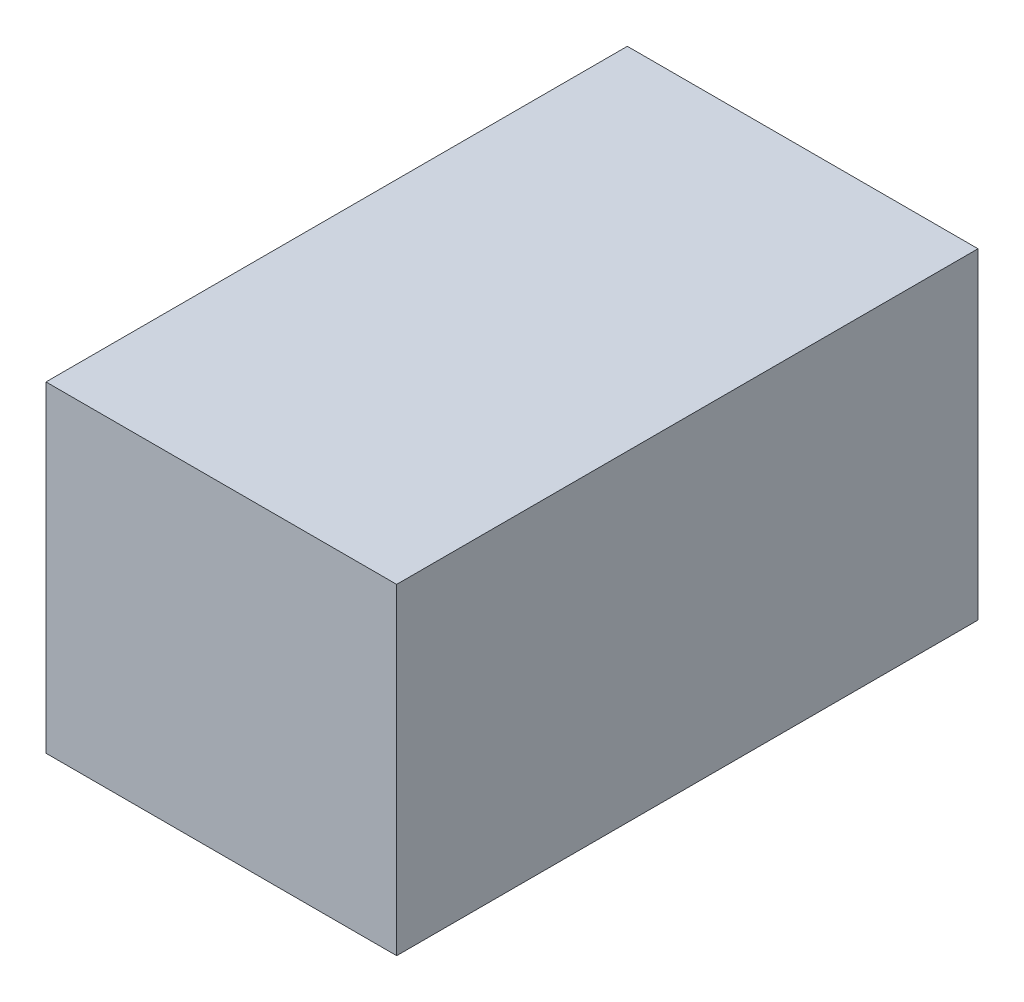
ISO-10303-21;
HEADER;
FILE_DESCRIPTION(('STEP AP214'),'2;1');
FILE_NAME('part.step','',(''),(''),'','','');
FILE_SCHEMA(('AUTOMOTIVE_DESIGN { 1 0 10303 214 1 1 1 1 }'));
ENDSEC;
DATA;
#1=APPLICATION_CONTEXT('core data for automotive mechanical design processes');
#2=APPLICATION_PROTOCOL_DEFINITION('international standard','automotive_design',2000,#1);
#3=PRODUCT_CONTEXT('',#1,'mechanical');
#4=PRODUCT('Part','Part','',(#3));
#5=PRODUCT_RELATED_PRODUCT_CATEGORY('part','',(#4));
#6=PRODUCT_DEFINITION_FORMATION('','',#4);
#7=PRODUCT_DEFINITION_CONTEXT('part definition',#1,'design');
#8=PRODUCT_DEFINITION('design','',#6,#7);
#9=PRODUCT_DEFINITION_SHAPE('','',#8);
#10=(LENGTH_UNIT() NAMED_UNIT(*) SI_UNIT(.MILLI.,.METRE.));
#11=(NAMED_UNIT(*) PLANE_ANGLE_UNIT() SI_UNIT($,.RADIAN.));
#12=(NAMED_UNIT(*) SI_UNIT($,.STERADIAN.) SOLID_ANGLE_UNIT());
#13=UNCERTAINTY_MEASURE_WITH_UNIT(LENGTH_MEASURE(1.E-05),#10,'distance_accuracy_value','');
#14=(GEOMETRIC_REPRESENTATION_CONTEXT(3) GLOBAL_UNCERTAINTY_ASSIGNED_CONTEXT((#13)) GLOBAL_UNIT_ASSIGNED_CONTEXT((#10,
#11,#12)) REPRESENTATION_CONTEXT('',''));
#15=CARTESIAN_POINT('',(0.,0.,0.));
#16=DIRECTION('',(0.,0.,1.));
#17=DIRECTION('',(1.,0.,0.));
#18=AXIS2_PLACEMENT_3D('',#15,#16,#17);
#19=CARTESIAN_POINT('',(-1086.5,576.,625.));
#20=DIRECTION('',(0.,1.,0.));
#21=DIRECTION('',(-1.,0.,0.));
#22=AXIS2_PLACEMENT_3D('',#19,#20,#21);
#23=PLANE('',#22);
#24=DIRECTION('',(1.,0.,0.));
#25=VECTOR('',#24,1.);
#26=CARTESIAN_POINT('',(-1370.,576.,1095.));
#27=LINE('',#26,#25);
#28=CARTESIAN_POINT('',(-1370.,576.,1095.));
#29=VERTEX_POINT('',#28);
#30=CARTESIAN_POINT('',(-803.,576.,1095.));
#31=VERTEX_POINT('',#30);
#32=EDGE_CURVE('E56',#29,#31,#27,.T.);
#33=ORIENTED_EDGE('',*,*,#32,.F.);
#34=DIRECTION('',(0.,0.,1.));
#35=VECTOR('',#34,1.);
#36=CARTESIAN_POINT('',(-1370.,576.,155.));
#37=LINE('',#36,#35);
#38=CARTESIAN_POINT('',(-1370.,576.,155.));
#39=VERTEX_POINT('',#38);
#40=EDGE_CURVE('E36',#39,#29,#37,.T.);
#41=ORIENTED_EDGE('',*,*,#40,.F.);
#42=DIRECTION('',(-1.,0.,0.));
#43=VECTOR('',#42,1.);
#44=CARTESIAN_POINT('',(-803.,576.,155.));
#45=LINE('',#44,#43);
#46=CARTESIAN_POINT('',(-803.,576.,155.));
#47=VERTEX_POINT('',#46);
#48=EDGE_CURVE('E65',#47,#39,#45,.T.);
#49=ORIENTED_EDGE('',*,*,#48,.F.);
#50=DIRECTION('',(0.,0.,-1.));
#51=VECTOR('',#50,1.);
#52=CARTESIAN_POINT('',(-803.,576.,1095.));
#53=LINE('',#52,#51);
#54=EDGE_CURVE('E27',#31,#47,#53,.T.);
#55=ORIENTED_EDGE('',*,*,#54,.F.);
#56=EDGE_LOOP('',(#33,#41,#49,#55));
#57=FACE_BOUND('',#56,.T.);
#58=ADVANCED_FACE('F17',(#57),#23,.F.);
#59=CARTESIAN_POINT('',(-803.,576.,1095.));
#60=DIRECTION('',(1.,0.,0.));
#61=DIRECTION('',(0.,1.,0.));
#62=AXIS2_PLACEMENT_3D('',#59,#60,#61);
#63=PLANE('',#62);
#64=DIRECTION('',(0.,1.,0.));
#65=VECTOR('',#64,1.);
#66=CARTESIAN_POINT('',(-803.,576.,155.));
#67=LINE('',#66,#65);
#68=CARTESIAN_POINT('',(-803.,1096.,155.));
#69=VERTEX_POINT('',#68);
#70=EDGE_CURVE('E11',#47,#69,#67,.T.);
#71=ORIENTED_EDGE('',*,*,#70,.T.);
#72=DIRECTION('',(0.,0.,-1.));
#73=VECTOR('',#72,1.);
#74=CARTESIAN_POINT('',(-803.,1096.,1095.));
#75=LINE('',#74,#73);
#76=CARTESIAN_POINT('',(-803.,1096.,1095.));
#77=VERTEX_POINT('',#76);
#78=EDGE_CURVE('E71',#77,#69,#75,.T.);
#79=ORIENTED_EDGE('',*,*,#78,.F.);
#80=DIRECTION('',(0.,1.,0.));
#81=VECTOR('',#80,1.);
#82=CARTESIAN_POINT('',(-803.,576.,1095.));
#83=LINE('',#82,#81);
#84=EDGE_CURVE('E60',#31,#77,#83,.T.);
#85=ORIENTED_EDGE('',*,*,#84,.F.);
#86=ORIENTED_EDGE('',*,*,#54,.T.);
#87=EDGE_LOOP('',(#71,#79,#85,#86));
#88=FACE_BOUND('',#87,.T.);
#89=ADVANCED_FACE('F70',(#88),#63,.T.);
#90=CARTESIAN_POINT('',(-1370.,576.,1095.));
#91=DIRECTION('',(0.,0.,1.));
#92=DIRECTION('',(-1.,0.,0.));
#93=AXIS2_PLACEMENT_3D('',#90,#91,#92);
#94=PLANE('',#93);
#95=ORIENTED_EDGE('',*,*,#84,.T.);
#96=DIRECTION('',(1.,0.,0.));
#97=VECTOR('',#96,1.);
#98=CARTESIAN_POINT('',(-1370.,1096.,1095.));
#99=LINE('',#98,#97);
#100=CARTESIAN_POINT('',(-1370.,1096.,1095.));
#101=VERTEX_POINT('',#100);
#102=EDGE_CURVE('E75',#101,#77,#99,.T.);
#103=ORIENTED_EDGE('',*,*,#102,.F.);
#104=DIRECTION('',(0.,1.,0.));
#105=VECTOR('',#104,1.);
#106=CARTESIAN_POINT('',(-1370.,576.,1095.));
#107=LINE('',#106,#105);
#108=EDGE_CURVE('E62',#29,#101,#107,.T.);
#109=ORIENTED_EDGE('',*,*,#108,.F.);
#110=ORIENTED_EDGE('',*,*,#32,.T.);
#111=EDGE_LOOP('',(#95,#103,#109,#110));
#112=FACE_BOUND('',#111,.T.);
#113=ADVANCED_FACE('F58',(#112),#94,.T.);
#114=CARTESIAN_POINT('',(-1370.,576.,155.));
#115=DIRECTION('',(-1.,0.,0.));
#116=DIRECTION('',(0.,0.,1.));
#117=AXIS2_PLACEMENT_3D('',#114,#115,#116);
#118=PLANE('',#117);
#119=ORIENTED_EDGE('',*,*,#108,.T.);
#120=DIRECTION('',(0.,0.,1.));
#121=VECTOR('',#120,1.);
#122=CARTESIAN_POINT('',(-1370.,1096.,155.));
#123=LINE('',#122,#121);
#124=CARTESIAN_POINT('',(-1370.,1096.,155.));
#125=VERTEX_POINT('',#124);
#126=EDGE_CURVE('E79',#125,#101,#123,.T.);
#127=ORIENTED_EDGE('',*,*,#126,.F.);
#128=DIRECTION('',(0.,1.,0.));
#129=VECTOR('',#128,1.);
#130=CARTESIAN_POINT('',(-1370.,576.,155.));
#131=LINE('',#130,#129);
#132=EDGE_CURVE('E21',#39,#125,#131,.T.);
#133=ORIENTED_EDGE('',*,*,#132,.F.);
#134=ORIENTED_EDGE('',*,*,#40,.T.);
#135=EDGE_LOOP('',(#119,#127,#133,#134));
#136=FACE_BOUND('',#135,.T.);
#137=ADVANCED_FACE('F19',(#136),#118,.T.);
#138=CARTESIAN_POINT('',(-803.,576.,155.));
#139=DIRECTION('',(0.,0.,-1.));
#140=DIRECTION('',(0.,-1.,0.));
#141=AXIS2_PLACEMENT_3D('',#138,#139,#140);
#142=PLANE('',#141);
#143=ORIENTED_EDGE('',*,*,#132,.T.);
#144=DIRECTION('',(-1.,0.,0.));
#145=VECTOR('',#144,1.);
#146=CARTESIAN_POINT('',(-803.,1096.,155.));
#147=LINE('',#146,#145);
#148=EDGE_CURVE('E76',#69,#125,#147,.T.);
#149=ORIENTED_EDGE('',*,*,#148,.F.);
#150=ORIENTED_EDGE('',*,*,#70,.F.);
#151=ORIENTED_EDGE('',*,*,#48,.T.);
#152=EDGE_LOOP('',(#143,#149,#150,#151));
#153=FACE_BOUND('',#152,.T.);
#154=ADVANCED_FACE('F91',(#153),#142,.T.);
#155=CARTESIAN_POINT('',(-1086.5,1096.,625.));
#156=DIRECTION('',(0.,1.,0.));
#157=DIRECTION('',(-1.,0.,0.));
#158=AXIS2_PLACEMENT_3D('',#155,#156,#157);
#159=PLANE('',#158);
#160=ORIENTED_EDGE('',*,*,#148,.T.);
#161=ORIENTED_EDGE('',*,*,#126,.T.);
#162=ORIENTED_EDGE('',*,*,#102,.T.);
#163=ORIENTED_EDGE('',*,*,#78,.T.);
#164=EDGE_LOOP('',(#160,#161,#162,#163));
#165=FACE_BOUND('',#164,.T.);
#166=ADVANCED_FACE('F88',(#165),#159,.T.);
#167=CLOSED_SHELL('',(#58,#89,#113,#137,#154,#166));
#168=MANIFOLD_SOLID_BREP('B1',#167);
#169=ADVANCED_BREP_SHAPE_REPRESENTATION('',(#18,#168),#14);
#170=SHAPE_DEFINITION_REPRESENTATION(#9,#169);
ENDSEC;
END-ISO-10303-21;
